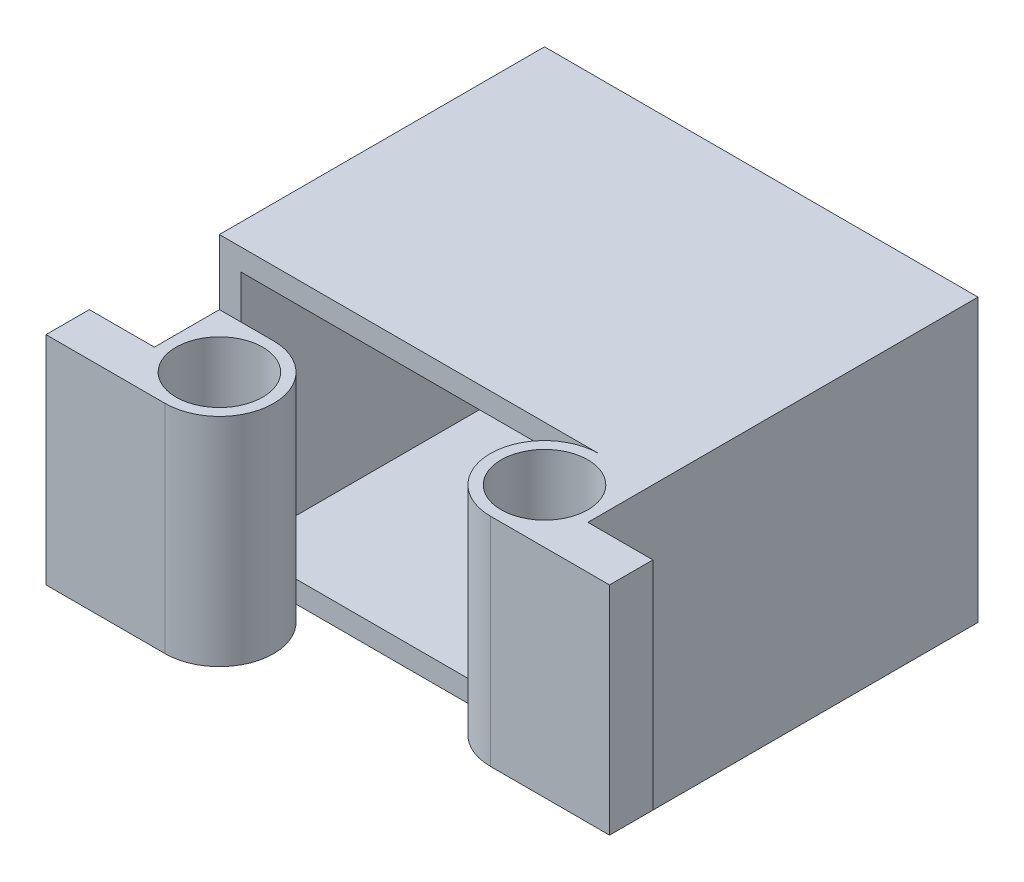
ISO-10303-21;
HEADER;
FILE_DESCRIPTION(('STEP AP214'),'2;1');
FILE_NAME('part.step','',(''),(''),'','','');
FILE_SCHEMA(('AUTOMOTIVE_DESIGN { 1 0 10303 214 1 1 1 1 }'));
ENDSEC;
DATA;
#1=APPLICATION_CONTEXT('core data for automotive mechanical design processes');
#2=APPLICATION_PROTOCOL_DEFINITION('international standard','automotive_design',2000,#1);
#3=PRODUCT_CONTEXT('',#1,'mechanical');
#4=PRODUCT('Part','Part','',(#3));
#5=PRODUCT_RELATED_PRODUCT_CATEGORY('part','',(#4));
#6=PRODUCT_DEFINITION_FORMATION('','',#4);
#7=PRODUCT_DEFINITION_CONTEXT('part definition',#1,'design');
#8=PRODUCT_DEFINITION('design','',#6,#7);
#9=PRODUCT_DEFINITION_SHAPE('','',#8);
#10=(LENGTH_UNIT() NAMED_UNIT(*) SI_UNIT(.MILLI.,.METRE.));
#11=(NAMED_UNIT(*) PLANE_ANGLE_UNIT() SI_UNIT($,.RADIAN.));
#12=(NAMED_UNIT(*) SI_UNIT($,.STERADIAN.) SOLID_ANGLE_UNIT());
#13=UNCERTAINTY_MEASURE_WITH_UNIT(LENGTH_MEASURE(1.E-05),#10,'distance_accuracy_value','');
#14=(GEOMETRIC_REPRESENTATION_CONTEXT(3) GLOBAL_UNCERTAINTY_ASSIGNED_CONTEXT((#13)) GLOBAL_UNIT_ASSIGNED_CONTEXT((#10,
#11,#12)) REPRESENTATION_CONTEXT('',''));
#15=CARTESIAN_POINT('',(0.,0.,0.));
#16=DIRECTION('',(0.,0.,1.));
#17=DIRECTION('',(1.,0.,0.));
#18=AXIS2_PLACEMENT_3D('',#15,#16,#17);
#19=CARTESIAN_POINT('',(10.,-6.5,15.));
#20=DIRECTION('',(-1.,0.,0.));
#21=DIRECTION('',(0.,0.,1.));
#22=AXIS2_PLACEMENT_3D('',#19,#20,#21);
#23=PLANE('',#22);
#24=DIRECTION('',(0.,1.,0.));
#25=VECTOR('',#24,1.);
#26=CARTESIAN_POINT('',(10.,6.5,18.));
#27=LINE('',#26,#25);
#28=CARTESIAN_POINT('',(10.,-3.5,18.));
#29=VERTEX_POINT('',#28);
#30=CARTESIAN_POINT('',(10.,6.5,18.));
#31=VERTEX_POINT('',#30);
#32=EDGE_CURVE('E55',#29,#31,#27,.T.);
#33=ORIENTED_EDGE('',*,*,#32,.F.);
#34=DIRECTION('',(0.,0.,1.));
#35=VECTOR('',#34,1.);
#36=CARTESIAN_POINT('',(10.,-3.5,0.));
#37=LINE('',#36,#35);
#38=CARTESIAN_POINT('',(10.,-3.5,15.));
#39=VERTEX_POINT('',#38);
#40=EDGE_CURVE('E189',#39,#29,#37,.T.);
#41=ORIENTED_EDGE('',*,*,#40,.F.);
#42=DIRECTION('',(0.,1.,0.));
#43=VECTOR('',#42,1.);
#44=CARTESIAN_POINT('',(10.,-6.5,15.));
#45=LINE('',#44,#43);
#46=CARTESIAN_POINT('',(10.,-6.5,15.));
#47=VERTEX_POINT('',#46);
#48=EDGE_CURVE('E280',#47,#39,#45,.T.);
#49=ORIENTED_EDGE('',*,*,#48,.F.);
#50=DIRECTION('',(0.,0.,-1.));
#51=VECTOR('',#50,1.);
#52=CARTESIAN_POINT('',(10.,-6.5,15.));
#53=LINE('',#52,#51);
#54=CARTESIAN_POINT('',(10.,-6.5,0.));
#55=VERTEX_POINT('',#54);
#56=EDGE_CURVE('E291',#47,#55,#53,.T.);
#57=ORIENTED_EDGE('',*,*,#56,.T.);
#58=DIRECTION('',(0.,1.,0.));
#59=VECTOR('',#58,1.);
#60=CARTESIAN_POINT('',(10.,-6.5,0.));
#61=LINE('',#60,#59);
#62=CARTESIAN_POINT('',(10.,6.5,0.));
#63=VERTEX_POINT('',#62);
#64=EDGE_CURVE('E252',#55,#63,#61,.T.);
#65=ORIENTED_EDGE('',*,*,#64,.T.);
#66=DIRECTION('',(0.,0.,-1.));
#67=VECTOR('',#66,1.);
#68=CARTESIAN_POINT('',(10.,6.5,15.));
#69=LINE('',#68,#67);
#70=EDGE_CURVE('E305',#31,#63,#69,.T.);
#71=ORIENTED_EDGE('',*,*,#70,.F.);
#72=EDGE_LOOP('',(#33,#41,#49,#57,#65,#71));
#73=FACE_BOUND('',#72,.T.);
#74=ADVANCED_FACE('F39',(#73),#23,.F.);
#75=CARTESIAN_POINT('',(0.,-6.5,20.));
#76=DIRECTION('',(0.,0.,1.));
#77=DIRECTION('',(1.,0.,0.));
#78=AXIS2_PLACEMENT_3D('',#75,#76,#77);
#79=PLANE('',#78);
#80=DIRECTION('',(1.,0.,0.));
#81=VECTOR('',#80,1.);
#82=CARTESIAN_POINT('',(0.,3.5,20.));
#83=LINE('',#82,#81);
#84=CARTESIAN_POINT('',(-13.,3.5,20.));
#85=VERTEX_POINT('',#84);
#86=CARTESIAN_POINT('',(-7.5,3.5,20.));
#87=VERTEX_POINT('',#86);
#88=EDGE_CURVE('E326',#85,#87,#83,.T.);
#89=ORIENTED_EDGE('',*,*,#88,.F.);
#90=DIRECTION('',(0.,1.,0.));
#91=VECTOR('',#90,1.);
#92=CARTESIAN_POINT('',(-13.,3.5,20.));
#93=LINE('',#92,#91);
#94=CARTESIAN_POINT('',(-13.,-6.5,20.));
#95=VERTEX_POINT('',#94);
#96=EDGE_CURVE('E308',#95,#85,#93,.T.);
#97=ORIENTED_EDGE('',*,*,#96,.F.);
#98=DIRECTION('',(1.,0.,0.));
#99=VECTOR('',#98,1.);
#100=CARTESIAN_POINT('',(0.,-6.5,20.));
#101=LINE('',#100,#99);
#102=CARTESIAN_POINT('',(-7.5,-6.5,20.));
#103=VERTEX_POINT('',#102);
#104=EDGE_CURVE('E327',#95,#103,#101,.T.);
#105=ORIENTED_EDGE('',*,*,#104,.T.);
#106=DIRECTION('',(0.,1.,0.));
#107=VECTOR('',#106,1.);
#108=CARTESIAN_POINT('',(-7.5,-6.5,20.));
#109=LINE('',#108,#107);
#110=EDGE_CURVE('E43',#103,#87,#109,.T.);
#111=ORIENTED_EDGE('',*,*,#110,.T.);
#112=EDGE_LOOP('',(#89,#97,#105,#111));
#113=FACE_BOUND('',#112,.T.);
#114=ADVANCED_FACE('F41',(#113),#79,.T.);
#115=CARTESIAN_POINT('',(-10.,-6.5,0.));
#116=DIRECTION('',(-1.,0.,0.));
#117=DIRECTION('',(0.,0.,1.));
#118=AXIS2_PLACEMENT_3D('',#115,#116,#117);
#119=PLANE('',#118);
#120=DIRECTION('',(0.,-1.,0.));
#121=VECTOR('',#120,1.);
#122=CARTESIAN_POINT('',(-10.,3.5,18.));
#123=LINE('',#122,#121);
#124=CARTESIAN_POINT('',(-10.,3.5,18.));
#125=VERTEX_POINT('',#124);
#126=CARTESIAN_POINT('',(-10.,-6.5,18.));
#127=VERTEX_POINT('',#126);
#128=EDGE_CURVE('E307',#125,#127,#123,.T.);
#129=ORIENTED_EDGE('',*,*,#128,.F.);
#130=DIRECTION('',(0.,0.,1.));
#131=VECTOR('',#130,1.);
#132=CARTESIAN_POINT('',(-10.,3.5,0.));
#133=LINE('',#132,#131);
#134=CARTESIAN_POINT('',(-10.,3.5,15.));
#135=VERTEX_POINT('',#134);
#136=EDGE_CURVE('E347',#135,#125,#133,.T.);
#137=ORIENTED_EDGE('',*,*,#136,.F.);
#138=DIRECTION('',(0.,-1.,0.));
#139=VECTOR('',#138,1.);
#140=CARTESIAN_POINT('',(-10.,-6.5,15.));
#141=LINE('',#140,#139);
#142=CARTESIAN_POINT('',(-10.,6.5,15.));
#143=VERTEX_POINT('',#142);
#144=EDGE_CURVE('E286',#143,#135,#141,.T.);
#145=ORIENTED_EDGE('',*,*,#144,.F.);
#146=DIRECTION('',(0.,0.,-1.));
#147=VECTOR('',#146,1.);
#148=CARTESIAN_POINT('',(-10.,6.5,15.));
#149=LINE('',#148,#147);
#150=CARTESIAN_POINT('',(-10.,6.5,0.));
#151=VERTEX_POINT('',#150);
#152=EDGE_CURVE('E302',#143,#151,#149,.T.);
#153=ORIENTED_EDGE('',*,*,#152,.T.);
#154=DIRECTION('',(0.,-1.,0.));
#155=VECTOR('',#154,1.);
#156=CARTESIAN_POINT('',(-10.,-6.5,0.));
#157=LINE('',#156,#155);
#158=CARTESIAN_POINT('',(-10.,-6.5,0.));
#159=VERTEX_POINT('',#158);
#160=EDGE_CURVE('E296',#151,#159,#157,.T.);
#161=ORIENTED_EDGE('',*,*,#160,.T.);
#162=DIRECTION('',(0.,0.,1.));
#163=VECTOR('',#162,1.);
#164=CARTESIAN_POINT('',(-10.,-6.5,0.));
#165=LINE('',#164,#163);
#166=EDGE_CURVE('E333',#159,#127,#165,.T.);
#167=ORIENTED_EDGE('',*,*,#166,.T.);
#168=EDGE_LOOP('',(#129,#137,#145,#153,#161,#167));
#169=FACE_BOUND('',#168,.T.);
#170=ADVANCED_FACE('F376',(#169),#119,.T.);
#171=CARTESIAN_POINT('',(0.,-6.5,15.));
#172=DIRECTION('',(0.,0.,1.));
#173=DIRECTION('',(1.,0.,0.));
#174=AXIS2_PLACEMENT_3D('',#171,#172,#173);
#175=PLANE('',#174);
#176=DIRECTION('',(1.,0.,0.));
#177=VECTOR('',#176,1.);
#178=CARTESIAN_POINT('',(0.,-5.5,15.));
#179=LINE('',#178,#177);
#180=CARTESIAN_POINT('',(-9.,-5.5,15.));
#181=VERTEX_POINT('',#180);
#182=CARTESIAN_POINT('',(-7.5,-5.5,15.));
#183=VERTEX_POINT('',#182);
#184=EDGE_CURVE('E63',#181,#183,#179,.T.);
#185=ORIENTED_EDGE('',*,*,#184,.F.);
#186=DIRECTION('',(0.,-1.,0.));
#187=VECTOR('',#186,1.);
#188=CARTESIAN_POINT('',(-9.,0.,15.));
#189=LINE('',#188,#187);
#190=CARTESIAN_POINT('',(-9.,3.5,15.));
#191=VERTEX_POINT('',#190);
#192=EDGE_CURVE('E274',#191,#181,#189,.T.);
#193=ORIENTED_EDGE('',*,*,#192,.F.);
#194=DIRECTION('',(1.,0.,0.));
#195=VECTOR('',#194,1.);
#196=CARTESIAN_POINT('',(0.,3.5,15.));
#197=LINE('',#196,#195);
#198=CARTESIAN_POINT('',(-7.5,3.5,15.));
#199=VERTEX_POINT('',#198);
#200=EDGE_CURVE('E343',#191,#199,#197,.T.);
#201=ORIENTED_EDGE('',*,*,#200,.T.);
#202=DIRECTION('',(0.,1.,0.));
#203=VECTOR('',#202,1.);
#204=CARTESIAN_POINT('',(-7.5,-6.5,15.));
#205=LINE('',#204,#203);
#206=EDGE_CURVE('E48',#183,#199,#205,.T.);
#207=ORIENTED_EDGE('',*,*,#206,.F.);
#208=EDGE_LOOP('',(#185,#193,#201,#207));
#209=FACE_BOUND('',#208,.T.);
#210=ADVANCED_FACE('F420',(#209),#175,.F.);
#211=CARTESIAN_POINT('',(-7.5,-6.5,17.5));
#212=DIRECTION('',(0.,1.,0.));
#213=DIRECTION('',(0.,0.,1.));
#214=AXIS2_PLACEMENT_3D('',#211,#212,#213);
#215=CYLINDRICAL_SURFACE('',#214,2.5);
#216=CARTESIAN_POINT('',(-7.5,3.5,17.5));
#217=DIRECTION('',(0.,1.,0.));
#218=DIRECTION('',(0.,0.,1.));
#219=AXIS2_PLACEMENT_3D('',#216,#217,#218);
#220=CIRCLE('',#219,2.5);
#221=EDGE_CURVE('E340',#87,#199,#220,.T.);
#222=ORIENTED_EDGE('',*,*,#221,.F.);
#223=ORIENTED_EDGE('',*,*,#110,.F.);
#224=CARTESIAN_POINT('',(-7.5,-6.5,17.5));
#225=DIRECTION('',(0.,1.,0.));
#226=DIRECTION('',(0.,0.,1.));
#227=AXIS2_PLACEMENT_3D('',#224,#225,#226);
#228=CIRCLE('',#227,2.5);
#229=CARTESIAN_POINT('',(-7.5,-6.5,15.));
#230=VERTEX_POINT('',#229);
#231=EDGE_CURVE('E330',#103,#230,#228,.T.);
#232=ORIENTED_EDGE('',*,*,#231,.T.);
#233=EDGE_CURVE('E11',#230,#183,#205,.T.);
#234=ORIENTED_EDGE('',*,*,#233,.T.);
#235=ORIENTED_EDGE('',*,*,#206,.T.);
#236=EDGE_LOOP('',(#222,#223,#232,#234,#235));
#237=FACE_BOUND('',#236,.T.);
#238=ADVANCED_FACE('F405',(#237),#215,.T.);
#239=CARTESIAN_POINT('',(-7.5,-6.5,17.5));
#240=DIRECTION('',(0.,1.,0.));
#241=DIRECTION('',(0.,0.,1.));
#242=AXIS2_PLACEMENT_3D('',#239,#240,#241);
#243=CYLINDRICAL_SURFACE('',#242,2.);
#244=CARTESIAN_POINT('',(-7.5,-6.5,17.5));
#245=DIRECTION('',(0.,1.,0.));
#246=DIRECTION('',(0.,0.,1.));
#247=AXIS2_PLACEMENT_3D('',#244,#245,#246);
#248=CIRCLE('',#247,2.);
#249=CARTESIAN_POINT('',(-7.5,-6.5,19.5));
#250=VERTEX_POINT('',#249);
#251=EDGE_CURVE('E335',#250,#250,#248,.T.);
#252=ORIENTED_EDGE('',*,*,#251,.F.);
#253=EDGE_LOOP('',(#252));
#254=FACE_BOUND('',#253,.T.);
#255=CARTESIAN_POINT('',(-7.5,3.5,17.5));
#256=DIRECTION('',(0.,1.,0.));
#257=DIRECTION('',(0.,0.,1.));
#258=AXIS2_PLACEMENT_3D('',#255,#256,#257);
#259=CIRCLE('',#258,2.);
#260=CARTESIAN_POINT('',(-7.5,3.5,19.5));
#261=VERTEX_POINT('',#260);
#262=EDGE_CURVE('E331',#261,#261,#259,.T.);
#263=ORIENTED_EDGE('',*,*,#262,.T.);
#264=EDGE_LOOP('',(#263));
#265=FACE_BOUND('',#264,.T.);
#266=ADVANCED_FACE('F353',(#254,#265),#243,.F.);
#267=CARTESIAN_POINT('',(0.,-6.5,0.));
#268=DIRECTION('',(0.,1.,0.));
#269=DIRECTION('',(0.,0.,1.));
#270=AXIS2_PLACEMENT_3D('',#267,#268,#269);
#271=PLANE('',#270);
#272=ORIENTED_EDGE('',*,*,#104,.F.);
#273=DIRECTION('',(0.,0.,1.));
#274=VECTOR('',#273,1.);
#275=CARTESIAN_POINT('',(-13.,-6.5,20.));
#276=LINE('',#275,#274);
#277=CARTESIAN_POINT('',(-13.,-6.5,18.));
#278=VERTEX_POINT('',#277);
#279=EDGE_CURVE('E315',#278,#95,#276,.T.);
#280=ORIENTED_EDGE('',*,*,#279,.F.);
#281=DIRECTION('',(1.,0.,0.));
#282=VECTOR('',#281,1.);
#283=CARTESIAN_POINT('',(-13.,-6.5,18.));
#284=LINE('',#283,#282);
#285=EDGE_CURVE('E318',#278,#127,#284,.T.);
#286=ORIENTED_EDGE('',*,*,#285,.T.);
#287=ORIENTED_EDGE('',*,*,#166,.F.);
#288=DIRECTION('',(1.,0.,0.));
#289=VECTOR('',#288,1.);
#290=CARTESIAN_POINT('',(-10.,-6.5,0.));
#291=LINE('',#290,#289);
#292=EDGE_CURVE('E284',#159,#55,#291,.T.);
#293=ORIENTED_EDGE('',*,*,#292,.T.);
#294=ORIENTED_EDGE('',*,*,#56,.F.);
#295=DIRECTION('',(1.,0.,0.));
#296=VECTOR('',#295,1.);
#297=CARTESIAN_POINT('',(-10.,-6.5,15.));
#298=LINE('',#297,#296);
#299=EDGE_CURVE('E289',#230,#47,#298,.T.);
#300=ORIENTED_EDGE('',*,*,#299,.F.);
#301=ORIENTED_EDGE('',*,*,#231,.F.);
#302=EDGE_LOOP('',(#272,#280,#286,#287,#293,#294,#300,#301));
#303=FACE_BOUND('',#302,.T.);
#304=ORIENTED_EDGE('',*,*,#251,.T.);
#305=EDGE_LOOP('',(#304));
#306=FACE_BOUND('',#305,.T.);
#307=ADVANCED_FACE('F358',(#303,#306),#271,.F.);
#308=CARTESIAN_POINT('',(0.,3.5,0.));
#309=DIRECTION('',(0.,1.,0.));
#310=DIRECTION('',(0.,0.,1.));
#311=AXIS2_PLACEMENT_3D('',#308,#309,#310);
#312=PLANE('',#311);
#313=ORIENTED_EDGE('',*,*,#88,.T.);
#314=ORIENTED_EDGE('',*,*,#221,.T.);
#315=ORIENTED_EDGE('',*,*,#200,.F.);
#316=EDGE_CURVE('E344',#135,#191,#197,.T.);
#317=ORIENTED_EDGE('',*,*,#316,.F.);
#318=ORIENTED_EDGE('',*,*,#136,.T.);
#319=DIRECTION('',(1.,0.,0.));
#320=VECTOR('',#319,1.);
#321=CARTESIAN_POINT('',(-13.,3.5,18.));
#322=LINE('',#321,#320);
#323=CARTESIAN_POINT('',(-13.,3.5,18.));
#324=VERTEX_POINT('',#323);
#325=EDGE_CURVE('E323',#324,#125,#322,.T.);
#326=ORIENTED_EDGE('',*,*,#325,.F.);
#327=DIRECTION('',(0.,0.,-1.));
#328=VECTOR('',#327,1.);
#329=CARTESIAN_POINT('',(-13.,3.5,20.));
#330=LINE('',#329,#328);
#331=EDGE_CURVE('E311',#85,#324,#330,.T.);
#332=ORIENTED_EDGE('',*,*,#331,.F.);
#333=EDGE_LOOP('',(#313,#314,#315,#317,#318,#326,#332));
#334=FACE_BOUND('',#333,.T.);
#335=ORIENTED_EDGE('',*,*,#262,.F.);
#336=EDGE_LOOP('',(#335));
#337=FACE_BOUND('',#336,.T.);
#338=ADVANCED_FACE('F355',(#334,#337),#312,.T.);
#339=CARTESIAN_POINT('',(-13.,3.5,18.));
#340=DIRECTION('',(0.,0.,1.));
#341=DIRECTION('',(1.,0.,0.));
#342=AXIS2_PLACEMENT_3D('',#339,#340,#341);
#343=PLANE('',#342);
#344=ORIENTED_EDGE('',*,*,#128,.T.);
#345=ORIENTED_EDGE('',*,*,#285,.F.);
#346=DIRECTION('',(0.,-1.,0.));
#347=VECTOR('',#346,1.);
#348=CARTESIAN_POINT('',(-13.,3.5,18.));
#349=LINE('',#348,#347);
#350=EDGE_CURVE('E313',#324,#278,#349,.T.);
#351=ORIENTED_EDGE('',*,*,#350,.F.);
#352=ORIENTED_EDGE('',*,*,#325,.T.);
#353=EDGE_LOOP('',(#344,#345,#351,#352));
#354=FACE_BOUND('',#353,.T.);
#355=ADVANCED_FACE('F357',(#354),#343,.F.);
#356=CARTESIAN_POINT('',(-13.,0.,0.));
#357=DIRECTION('',(1.,0.,0.));
#358=DIRECTION('',(0.,0.,-1.));
#359=AXIS2_PLACEMENT_3D('',#356,#357,#358);
#360=PLANE('',#359);
#361=ORIENTED_EDGE('',*,*,#96,.T.);
#362=ORIENTED_EDGE('',*,*,#331,.T.);
#363=ORIENTED_EDGE('',*,*,#350,.T.);
#364=ORIENTED_EDGE('',*,*,#279,.T.);
#365=EDGE_LOOP('',(#361,#362,#363,#364));
#366=FACE_BOUND('',#365,.T.);
#367=ADVANCED_FACE('F365',(#366),#360,.F.);
#368=CARTESIAN_POINT('',(0.,0.,15.));
#369=DIRECTION('',(0.,0.,-1.));
#370=DIRECTION('',(-1.,0.,0.));
#371=AXIS2_PLACEMENT_3D('',#368,#369,#370);
#372=PLANE('',#371);
#373=CARTESIAN_POINT('',(9.,-5.5,15.));
#374=VERTEX_POINT('',#373);
#375=EDGE_CURVE('E278',#183,#374,#179,.T.);
#376=ORIENTED_EDGE('',*,*,#375,.F.);
#377=ORIENTED_EDGE('',*,*,#233,.F.);
#378=ORIENTED_EDGE('',*,*,#299,.T.);
#379=ORIENTED_EDGE('',*,*,#48,.T.);
#380=DIRECTION('',(1.,0.,0.));
#381=VECTOR('',#380,1.);
#382=CARTESIAN_POINT('',(0.,-3.5,15.));
#383=LINE('',#382,#381);
#384=CARTESIAN_POINT('',(9.,-3.5,15.));
#385=VERTEX_POINT('',#384);
#386=EDGE_CURVE('E219',#385,#39,#383,.T.);
#387=ORIENTED_EDGE('',*,*,#386,.F.);
#388=DIRECTION('',(0.,1.,0.));
#389=VECTOR('',#388,1.);
#390=CARTESIAN_POINT('',(9.,0.,15.));
#391=LINE('',#390,#389);
#392=EDGE_CURVE('E267',#374,#385,#391,.T.);
#393=ORIENTED_EDGE('',*,*,#392,.F.);
#394=EDGE_LOOP('',(#376,#377,#378,#379,#387,#393));
#395=FACE_BOUND('',#394,.T.);
#396=ADVANCED_FACE('F383',(#395),#372,.F.);
#397=ORIENTED_EDGE('',*,*,#316,.T.);
#398=CARTESIAN_POINT('',(-9.,5.5,15.));
#399=VERTEX_POINT('',#398);
#400=EDGE_CURVE('E275',#399,#191,#189,.T.);
#401=ORIENTED_EDGE('',*,*,#400,.F.);
#402=DIRECTION('',(-1.,0.,0.));
#403=VECTOR('',#402,1.);
#404=CARTESIAN_POINT('',(0.,5.5,15.));
#405=LINE('',#404,#403);
#406=CARTESIAN_POINT('',(7.5,5.5,15.));
#407=VERTEX_POINT('',#406);
#408=EDGE_CURVE('E270',#407,#399,#405,.T.);
#409=ORIENTED_EDGE('',*,*,#408,.F.);
#410=DIRECTION('',(0.,1.,0.));
#411=VECTOR('',#410,1.);
#412=CARTESIAN_POINT('',(7.5,-3.5,15.));
#413=LINE('',#412,#411);
#414=CARTESIAN_POINT('',(7.5,6.5,15.));
#415=VERTEX_POINT('',#414);
#416=EDGE_CURVE('E225',#407,#415,#413,.T.);
#417=ORIENTED_EDGE('',*,*,#416,.T.);
#418=DIRECTION('',(-1.,0.,0.));
#419=VECTOR('',#418,1.);
#420=CARTESIAN_POINT('',(-10.,6.5,15.));
#421=LINE('',#420,#419);
#422=EDGE_CURVE('E283',#415,#143,#421,.T.);
#423=ORIENTED_EDGE('',*,*,#422,.T.);
#424=ORIENTED_EDGE('',*,*,#144,.T.);
#425=EDGE_LOOP('',(#397,#401,#409,#417,#423,#424));
#426=FACE_BOUND('',#425,.T.);
#427=ADVANCED_FACE('F388',(#426),#372,.F.);
#428=CARTESIAN_POINT('',(-10.,6.5,15.));
#429=DIRECTION('',(0.,-1.,0.));
#430=DIRECTION('',(0.,0.,-1.));
#431=AXIS2_PLACEMENT_3D('',#428,#429,#430);
#432=PLANE('',#431);
#433=DIRECTION('',(-1.,0.,0.));
#434=VECTOR('',#433,1.);
#435=CARTESIAN_POINT('',(-10.,6.5,0.));
#436=LINE('',#435,#434);
#437=EDGE_CURVE('E294',#63,#151,#436,.T.);
#438=ORIENTED_EDGE('',*,*,#437,.T.);
#439=ORIENTED_EDGE('',*,*,#152,.F.);
#440=ORIENTED_EDGE('',*,*,#422,.F.);
#441=CARTESIAN_POINT('',(7.5,6.5,17.5));
#442=DIRECTION('',(0.,1.,0.));
#443=DIRECTION('',(0.,0.,1.));
#444=AXIS2_PLACEMENT_3D('',#441,#442,#443);
#445=CIRCLE('',#444,2.5);
#446=CARTESIAN_POINT('',(7.5,6.5,20.));
#447=VERTEX_POINT('',#446);
#448=EDGE_CURVE('E216',#415,#447,#445,.T.);
#449=ORIENTED_EDGE('',*,*,#448,.T.);
#450=DIRECTION('',(1.,0.,0.));
#451=VECTOR('',#450,1.);
#452=CARTESIAN_POINT('',(0.,6.5,20.));
#453=LINE('',#452,#451);
#454=CARTESIAN_POINT('',(13.,6.5,20.));
#455=VERTEX_POINT('',#454);
#456=EDGE_CURVE('E228',#447,#455,#453,.T.);
#457=ORIENTED_EDGE('',*,*,#456,.T.);
#458=DIRECTION('',(0.,0.,1.));
#459=VECTOR('',#458,1.);
#460=CARTESIAN_POINT('',(13.,6.5,20.));
#461=LINE('',#460,#459);
#462=CARTESIAN_POINT('',(13.,6.5,18.));
#463=VERTEX_POINT('',#462);
#464=EDGE_CURVE('E206',#463,#455,#461,.T.);
#465=ORIENTED_EDGE('',*,*,#464,.F.);
#466=DIRECTION('',(-1.,0.,0.));
#467=VECTOR('',#466,1.);
#468=CARTESIAN_POINT('',(13.,6.5,18.));
#469=LINE('',#468,#467);
#470=EDGE_CURVE('E211',#463,#31,#469,.T.);
#471=ORIENTED_EDGE('',*,*,#470,.T.);
#472=ORIENTED_EDGE('',*,*,#70,.T.);
#473=EDGE_LOOP('',(#438,#439,#440,#449,#457,#465,#471,#472));
#474=FACE_BOUND('',#473,.T.);
#475=CARTESIAN_POINT('',(7.5,6.5,17.5));
#476=DIRECTION('',(0.,1.,0.));
#477=DIRECTION('',(0.,0.,1.));
#478=AXIS2_PLACEMENT_3D('',#475,#476,#477);
#479=CIRCLE('',#478,2.);
#480=CARTESIAN_POINT('',(7.5,6.5,19.5));
#481=VERTEX_POINT('',#480);
#482=EDGE_CURVE('E230',#481,#481,#479,.T.);
#483=ORIENTED_EDGE('',*,*,#482,.F.);
#484=EDGE_LOOP('',(#483));
#485=FACE_BOUND('',#484,.T.);
#486=ADVANCED_FACE('F380',(#474,#485),#432,.F.);
#487=CARTESIAN_POINT('',(0.,0.,0.));
#488=DIRECTION('',(0.,0.,-1.));
#489=DIRECTION('',(-1.,0.,0.));
#490=AXIS2_PLACEMENT_3D('',#487,#488,#489);
#491=PLANE('',#490);
#492=ORIENTED_EDGE('',*,*,#64,.F.);
#493=ORIENTED_EDGE('',*,*,#292,.F.);
#494=ORIENTED_EDGE('',*,*,#160,.F.);
#495=ORIENTED_EDGE('',*,*,#437,.F.);
#496=EDGE_LOOP('',(#492,#493,#494,#495));
#497=FACE_BOUND('',#496,.T.);
#498=ADVANCED_FACE('F431',(#497),#491,.T.);
#499=CARTESIAN_POINT('',(9.,-6.5,15.));
#500=DIRECTION('',(-1.,0.,0.));
#501=DIRECTION('',(0.,0.,1.));
#502=AXIS2_PLACEMENT_3D('',#499,#500,#501);
#503=PLANE('',#502);
#504=DIRECTION('',(0.,1.,0.));
#505=VECTOR('',#504,1.);
#506=CARTESIAN_POINT('',(9.,0.,1.));
#507=LINE('',#506,#505);
#508=CARTESIAN_POINT('',(9.,-5.5,1.));
#509=VERTEX_POINT('',#508);
#510=CARTESIAN_POINT('',(9.,5.5,1.));
#511=VERTEX_POINT('',#510);
#512=EDGE_CURVE('E243',#509,#511,#507,.T.);
#513=ORIENTED_EDGE('',*,*,#512,.F.);
#514=DIRECTION('',(0.,0.,-1.));
#515=VECTOR('',#514,1.);
#516=CARTESIAN_POINT('',(9.,-5.5,15.));
#517=LINE('',#516,#515);
#518=EDGE_CURVE('E254',#374,#509,#517,.T.);
#519=ORIENTED_EDGE('',*,*,#518,.F.);
#520=ORIENTED_EDGE('',*,*,#392,.T.);
#521=DIRECTION('',(0.,1.,0.));
#522=VECTOR('',#521,1.);
#523=CARTESIAN_POINT('',(9.,-6.5,15.));
#524=LINE('',#523,#522);
#525=CARTESIAN_POINT('',(9.,5.5,15.));
#526=VERTEX_POINT('',#525);
#527=EDGE_CURVE('E234',#385,#526,#524,.T.);
#528=ORIENTED_EDGE('',*,*,#527,.T.);
#529=DIRECTION('',(0.,0.,-1.));
#530=VECTOR('',#529,1.);
#531=CARTESIAN_POINT('',(9.,5.5,15.));
#532=LINE('',#531,#530);
#533=EDGE_CURVE('E249',#526,#511,#532,.T.);
#534=ORIENTED_EDGE('',*,*,#533,.T.);
#535=EDGE_LOOP('',(#513,#519,#520,#528,#534));
#536=FACE_BOUND('',#535,.T.);
#537=ADVANCED_FACE('F451',(#536),#503,.T.);
#538=CARTESIAN_POINT('',(-10.,5.5,15.));
#539=DIRECTION('',(0.,-1.,0.));
#540=DIRECTION('',(0.,0.,-1.));
#541=AXIS2_PLACEMENT_3D('',#538,#539,#540);
#542=PLANE('',#541);
#543=DIRECTION('',(-1.,0.,0.));
#544=VECTOR('',#543,1.);
#545=CARTESIAN_POINT('',(0.,5.5,1.));
#546=LINE('',#545,#544);
#547=CARTESIAN_POINT('',(-9.,5.5,1.));
#548=VERTEX_POINT('',#547);
#549=EDGE_CURVE('E248',#511,#548,#546,.T.);
#550=ORIENTED_EDGE('',*,*,#549,.F.);
#551=ORIENTED_EDGE('',*,*,#533,.F.);
#552=EDGE_CURVE('E271',#526,#407,#405,.T.);
#553=ORIENTED_EDGE('',*,*,#552,.T.);
#554=ORIENTED_EDGE('',*,*,#408,.T.);
#555=DIRECTION('',(0.,0.,-1.));
#556=VECTOR('',#555,1.);
#557=CARTESIAN_POINT('',(-9.,5.5,15.));
#558=LINE('',#557,#556);
#559=EDGE_CURVE('E253',#399,#548,#558,.T.);
#560=ORIENTED_EDGE('',*,*,#559,.T.);
#561=EDGE_LOOP('',(#550,#551,#553,#554,#560));
#562=FACE_BOUND('',#561,.T.);
#563=ADVANCED_FACE('F445',(#562),#542,.T.);
#564=CARTESIAN_POINT('',(-9.,-6.5,15.));
#565=DIRECTION('',(1.,0.,0.));
#566=DIRECTION('',(0.,0.,-1.));
#567=AXIS2_PLACEMENT_3D('',#564,#565,#566);
#568=PLANE('',#567);
#569=DIRECTION('',(0.,-1.,0.));
#570=VECTOR('',#569,1.);
#571=CARTESIAN_POINT('',(-9.,0.,1.));
#572=LINE('',#571,#570);
#573=CARTESIAN_POINT('',(-9.,-5.5,1.));
#574=VERTEX_POINT('',#573);
#575=EDGE_CURVE('E259',#548,#574,#572,.T.);
#576=ORIENTED_EDGE('',*,*,#575,.F.);
#577=ORIENTED_EDGE('',*,*,#559,.F.);
#578=ORIENTED_EDGE('',*,*,#400,.T.);
#579=ORIENTED_EDGE('',*,*,#192,.T.);
#580=DIRECTION('',(0.,0.,-1.));
#581=VECTOR('',#580,1.);
#582=CARTESIAN_POINT('',(-9.,-5.5,15.));
#583=LINE('',#582,#581);
#584=EDGE_CURVE('E257',#181,#574,#583,.T.);
#585=ORIENTED_EDGE('',*,*,#584,.T.);
#586=EDGE_LOOP('',(#576,#577,#578,#579,#585));
#587=FACE_BOUND('',#586,.T.);
#588=ADVANCED_FACE('F416',(#587),#568,.T.);
#589=CARTESIAN_POINT('',(-10.,-5.5,15.));
#590=DIRECTION('',(0.,1.,0.));
#591=DIRECTION('',(0.,0.,1.));
#592=AXIS2_PLACEMENT_3D('',#589,#590,#591);
#593=PLANE('',#592);
#594=DIRECTION('',(1.,0.,0.));
#595=VECTOR('',#594,1.);
#596=CARTESIAN_POINT('',(0.,-5.5,1.));
#597=LINE('',#596,#595);
#598=EDGE_CURVE('E263',#574,#509,#597,.T.);
#599=ORIENTED_EDGE('',*,*,#598,.F.);
#600=ORIENTED_EDGE('',*,*,#584,.F.);
#601=ORIENTED_EDGE('',*,*,#184,.T.);
#602=ORIENTED_EDGE('',*,*,#375,.T.);
#603=ORIENTED_EDGE('',*,*,#518,.T.);
#604=EDGE_LOOP('',(#599,#600,#601,#602,#603));
#605=FACE_BOUND('',#604,.T.);
#606=ADVANCED_FACE('F413',(#605),#593,.T.);
#607=CARTESIAN_POINT('',(0.,0.,1.));
#608=DIRECTION('',(0.,0.,-1.));
#609=DIRECTION('',(-1.,0.,0.));
#610=AXIS2_PLACEMENT_3D('',#607,#608,#609);
#611=PLANE('',#610);
#612=CARTESIAN_POINT('',(0.,0.,1.));
#613=DIRECTION('',(0.,0.,1.));
#614=DIRECTION('',(1.,0.,0.));
#615=AXIS2_PLACEMENT_3D('',#612,#613,#614);
#616=CIRCLE('',#615,4.9);
#617=CARTESIAN_POINT('',(4.9,0.,1.));
#618=VERTEX_POINT('',#617);
#619=EDGE_CURVE('E239',#618,#618,#616,.T.);
#620=ORIENTED_EDGE('',*,*,#619,.F.);
#621=EDGE_LOOP('',(#620));
#622=FACE_BOUND('',#621,.T.);
#623=ORIENTED_EDGE('',*,*,#512,.T.);
#624=ORIENTED_EDGE('',*,*,#549,.T.);
#625=ORIENTED_EDGE('',*,*,#575,.T.);
#626=ORIENTED_EDGE('',*,*,#598,.T.);
#627=EDGE_LOOP('',(#623,#624,#625,#626));
#628=FACE_BOUND('',#627,.T.);
#629=ADVANCED_FACE('F453',(#622,#628),#611,.F.);
#630=CARTESIAN_POINT('',(0.,0.,0.8));
#631=DIRECTION('',(0.,0.,1.));
#632=DIRECTION('',(1.,0.,0.));
#633=AXIS2_PLACEMENT_3D('',#630,#631,#632);
#634=CYLINDRICAL_SURFACE('',#633,4.9);
#635=CARTESIAN_POINT('',(0.,0.,0.8));
#636=DIRECTION('',(0.,0.,1.));
#637=DIRECTION('',(1.,0.,0.));
#638=AXIS2_PLACEMENT_3D('',#635,#636,#637);
#639=CIRCLE('',#638,4.9);
#640=CARTESIAN_POINT('',(4.9,0.,0.8));
#641=VERTEX_POINT('',#640);
#642=EDGE_CURVE('E240',#641,#641,#639,.T.);
#643=ORIENTED_EDGE('',*,*,#642,.F.);
#644=EDGE_LOOP('',(#643));
#645=FACE_BOUND('',#644,.T.);
#646=ORIENTED_EDGE('',*,*,#619,.T.);
#647=EDGE_LOOP('',(#646));
#648=FACE_BOUND('',#647,.T.);
#649=ADVANCED_FACE('F455',(#645,#648),#634,.F.);
#650=CARTESIAN_POINT('',(0.,0.,0.8));
#651=DIRECTION('',(0.,0.,1.));
#652=DIRECTION('',(1.,0.,0.));
#653=AXIS2_PLACEMENT_3D('',#650,#651,#652);
#654=PLANE('',#653);
#655=ORIENTED_EDGE('',*,*,#642,.T.);
#656=EDGE_LOOP('',(#655));
#657=FACE_BOUND('',#656,.T.);
#658=ADVANCED_FACE('F462',(#657),#654,.T.);
#659=CARTESIAN_POINT('',(0.,-3.5,15.));
#660=DIRECTION('',(0.,0.,1.));
#661=DIRECTION('',(1.,0.,0.));
#662=AXIS2_PLACEMENT_3D('',#659,#660,#661);
#663=PLANE('',#662);
#664=ORIENTED_EDGE('',*,*,#527,.F.);
#665=CARTESIAN_POINT('',(7.5,-3.5,15.));
#666=VERTEX_POINT('',#665);
#667=EDGE_CURVE('E217',#666,#385,#383,.T.);
#668=ORIENTED_EDGE('',*,*,#667,.F.);
#669=EDGE_CURVE('E235',#666,#407,#413,.T.);
#670=ORIENTED_EDGE('',*,*,#669,.T.);
#671=ORIENTED_EDGE('',*,*,#552,.F.);
#672=EDGE_LOOP('',(#664,#668,#670,#671));
#673=FACE_BOUND('',#672,.T.);
#674=ADVANCED_FACE('F447',(#673),#663,.F.);
#675=CARTESIAN_POINT('',(0.,-3.5,20.));
#676=DIRECTION('',(0.,0.,1.));
#677=DIRECTION('',(1.,0.,0.));
#678=AXIS2_PLACEMENT_3D('',#675,#676,#677);
#679=PLANE('',#678);
#680=ORIENTED_EDGE('',*,*,#456,.F.);
#681=DIRECTION('',(0.,1.,0.));
#682=VECTOR('',#681,1.);
#683=CARTESIAN_POINT('',(7.5,-3.5,20.));
#684=LINE('',#683,#682);
#685=CARTESIAN_POINT('',(7.5,-3.5,20.));
#686=VERTEX_POINT('',#685);
#687=EDGE_CURVE('E185',#686,#447,#684,.T.);
#688=ORIENTED_EDGE('',*,*,#687,.F.);
#689=DIRECTION('',(1.,0.,0.));
#690=VECTOR('',#689,1.);
#691=CARTESIAN_POINT('',(0.,-3.5,20.));
#692=LINE('',#691,#690);
#693=CARTESIAN_POINT('',(13.,-3.5,20.));
#694=VERTEX_POINT('',#693);
#695=EDGE_CURVE('E179',#686,#694,#692,.T.);
#696=ORIENTED_EDGE('',*,*,#695,.T.);
#697=DIRECTION('',(0.,-1.,0.));
#698=VECTOR('',#697,1.);
#699=CARTESIAN_POINT('',(13.,6.5,20.));
#700=LINE('',#699,#698);
#701=EDGE_CURVE('E184',#455,#694,#700,.T.);
#702=ORIENTED_EDGE('',*,*,#701,.F.);
#703=EDGE_LOOP('',(#680,#688,#696,#702));
#704=FACE_BOUND('',#703,.T.);
#705=ADVANCED_FACE('F182',(#704),#679,.T.);
#706=CARTESIAN_POINT('',(7.5,-3.5,17.5));
#707=DIRECTION('',(0.,1.,0.));
#708=DIRECTION('',(0.,0.,1.));
#709=AXIS2_PLACEMENT_3D('',#706,#707,#708);
#710=CYLINDRICAL_SURFACE('',#709,2.5);
#711=ORIENTED_EDGE('',*,*,#448,.F.);
#712=ORIENTED_EDGE('',*,*,#416,.F.);
#713=ORIENTED_EDGE('',*,*,#669,.F.);
#714=CARTESIAN_POINT('',(7.5,-3.5,17.5));
#715=DIRECTION('',(0.,1.,0.));
#716=DIRECTION('',(0.,0.,1.));
#717=AXIS2_PLACEMENT_3D('',#714,#715,#716);
#718=CIRCLE('',#717,2.5);
#719=EDGE_CURVE('E190',#666,#686,#718,.T.);
#720=ORIENTED_EDGE('',*,*,#719,.T.);
#721=ORIENTED_EDGE('',*,*,#687,.T.);
#722=EDGE_LOOP('',(#711,#712,#713,#720,#721));
#723=FACE_BOUND('',#722,.T.);
#724=ADVANCED_FACE('F442',(#723),#710,.T.);
#725=CARTESIAN_POINT('',(7.5,-3.5,17.5));
#726=DIRECTION('',(0.,1.,0.));
#727=DIRECTION('',(0.,0.,1.));
#728=AXIS2_PLACEMENT_3D('',#725,#726,#727);
#729=CYLINDRICAL_SURFACE('',#728,2.);
#730=CARTESIAN_POINT('',(7.5,-3.5,17.5));
#731=DIRECTION('',(0.,1.,0.));
#732=DIRECTION('',(0.,0.,1.));
#733=AXIS2_PLACEMENT_3D('',#730,#731,#732);
#734=CIRCLE('',#733,2.);
#735=CARTESIAN_POINT('',(7.5,-3.5,19.5));
#736=VERTEX_POINT('',#735);
#737=EDGE_CURVE('E222',#736,#736,#734,.T.);
#738=ORIENTED_EDGE('',*,*,#737,.F.);
#739=EDGE_LOOP('',(#738));
#740=FACE_BOUND('',#739,.T.);
#741=ORIENTED_EDGE('',*,*,#482,.T.);
#742=EDGE_LOOP('',(#741));
#743=FACE_BOUND('',#742,.T.);
#744=ADVANCED_FACE('F582',(#740,#743),#729,.F.);
#745=CARTESIAN_POINT('',(0.,-3.5,0.));
#746=DIRECTION('',(0.,1.,0.));
#747=DIRECTION('',(0.,0.,1.));
#748=AXIS2_PLACEMENT_3D('',#745,#746,#747);
#749=PLANE('',#748);
#750=ORIENTED_EDGE('',*,*,#667,.T.);
#751=ORIENTED_EDGE('',*,*,#386,.T.);
#752=ORIENTED_EDGE('',*,*,#40,.T.);
#753=DIRECTION('',(-1.,0.,0.));
#754=VECTOR('',#753,1.);
#755=CARTESIAN_POINT('',(13.,-3.5,18.));
#756=LINE('',#755,#754);
#757=CARTESIAN_POINT('',(13.,-3.5,18.));
#758=VERTEX_POINT('',#757);
#759=EDGE_CURVE('E198',#758,#29,#756,.T.);
#760=ORIENTED_EDGE('',*,*,#759,.F.);
#761=DIRECTION('',(0.,0.,-1.));
#762=VECTOR('',#761,1.);
#763=CARTESIAN_POINT('',(13.,-3.5,20.));
#764=LINE('',#763,#762);
#765=EDGE_CURVE('E193',#694,#758,#764,.T.);
#766=ORIENTED_EDGE('',*,*,#765,.F.);
#767=ORIENTED_EDGE('',*,*,#695,.F.);
#768=ORIENTED_EDGE('',*,*,#719,.F.);
#769=EDGE_LOOP('',(#750,#751,#752,#760,#766,#767,#768));
#770=FACE_BOUND('',#769,.T.);
#771=ORIENTED_EDGE('',*,*,#737,.T.);
#772=EDGE_LOOP('',(#771));
#773=FACE_BOUND('',#772,.T.);
#774=ADVANCED_FACE('F195',(#770,#773),#749,.F.);
#775=CARTESIAN_POINT('',(13.,6.5,18.));
#776=DIRECTION('',(0.,0.,1.));
#777=DIRECTION('',(1.,0.,0.));
#778=AXIS2_PLACEMENT_3D('',#775,#776,#777);
#779=PLANE('',#778);
#780=ORIENTED_EDGE('',*,*,#32,.T.);
#781=ORIENTED_EDGE('',*,*,#470,.F.);
#782=DIRECTION('',(0.,1.,0.));
#783=VECTOR('',#782,1.);
#784=CARTESIAN_POINT('',(13.,6.5,18.));
#785=LINE('',#784,#783);
#786=EDGE_CURVE('E201',#758,#463,#785,.T.);
#787=ORIENTED_EDGE('',*,*,#786,.F.);
#788=ORIENTED_EDGE('',*,*,#759,.T.);
#789=EDGE_LOOP('',(#780,#781,#787,#788));
#790=FACE_BOUND('',#789,.T.);
#791=ADVANCED_FACE('F438',(#790),#779,.F.);
#792=CARTESIAN_POINT('',(13.,0.,0.));
#793=DIRECTION('',(1.,0.,0.));
#794=DIRECTION('',(0.,0.,-1.));
#795=AXIS2_PLACEMENT_3D('',#792,#793,#794);
#796=PLANE('',#795);
#797=ORIENTED_EDGE('',*,*,#701,.T.);
#798=ORIENTED_EDGE('',*,*,#765,.T.);
#799=ORIENTED_EDGE('',*,*,#786,.T.);
#800=ORIENTED_EDGE('',*,*,#464,.T.);
#801=EDGE_LOOP('',(#797,#798,#799,#800));
#802=FACE_BOUND('',#801,.T.);
#803=ADVANCED_FACE('F204',(#802),#796,.T.);
#804=CLOSED_SHELL('',(#74,#114,#170,#210,#238,#266,#307,#338,#355,#367,#396,#427,#486,#498,#537,
#563,#588,#606,#629,#649,#658,#674,#705,#724,#744,#774,#791,#803));
#805=MANIFOLD_SOLID_BREP('B2',#804);
#806=ADVANCED_BREP_SHAPE_REPRESENTATION('',(#18,#805),#14);
#807=SHAPE_DEFINITION_REPRESENTATION(#9,#806);
ENDSEC;
END-ISO-10303-21;
